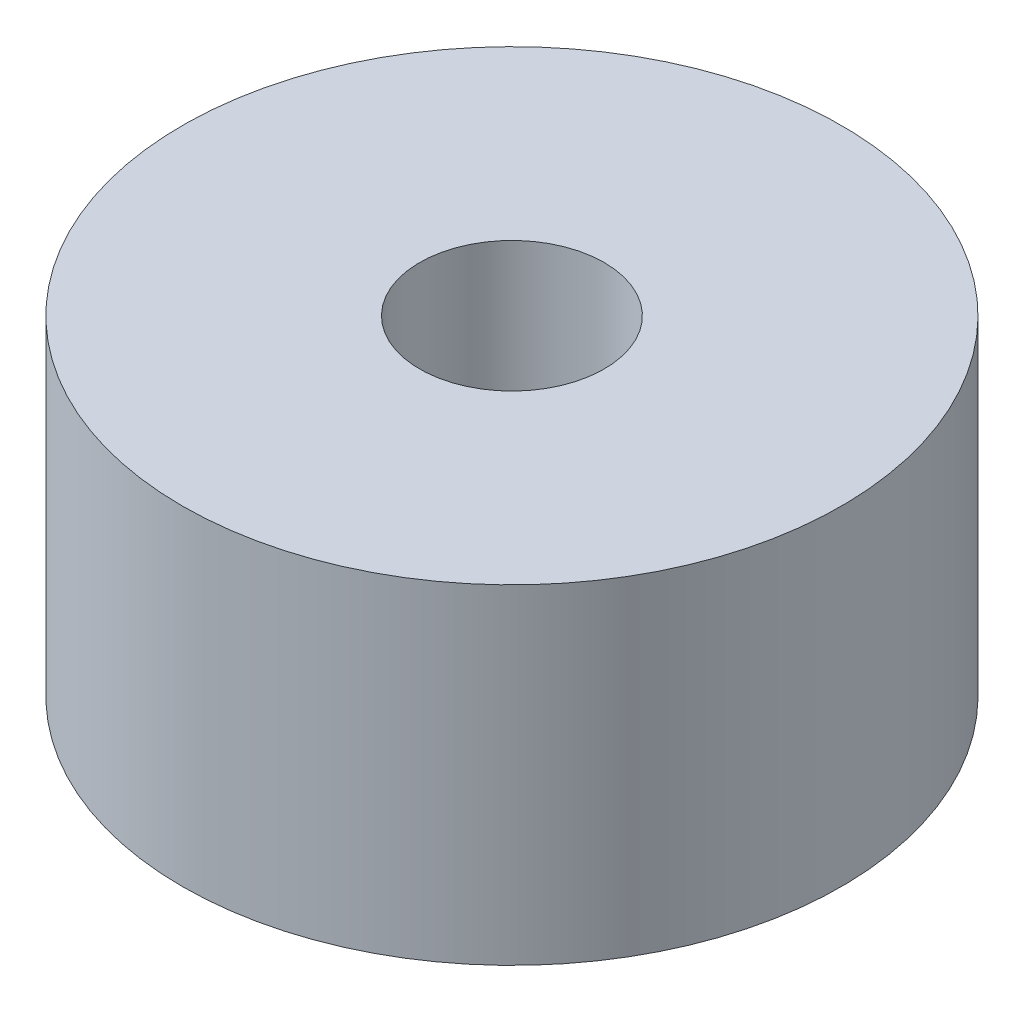
ISO-10303-21;
HEADER;
FILE_DESCRIPTION(('STEP AP214'),'2;1');
FILE_NAME('part.step','',(''),(''),'','','');
FILE_SCHEMA(('AUTOMOTIVE_DESIGN { 1 0 10303 214 1 1 1 1 }'));
ENDSEC;
DATA;
#1=APPLICATION_CONTEXT('core data for automotive mechanical design processes');
#2=APPLICATION_PROTOCOL_DEFINITION('international standard','automotive_design',2000,#1);
#3=PRODUCT_CONTEXT('',#1,'mechanical');
#4=PRODUCT('Part','Part','',(#3));
#5=PRODUCT_RELATED_PRODUCT_CATEGORY('part','',(#4));
#6=PRODUCT_DEFINITION_FORMATION('','',#4);
#7=PRODUCT_DEFINITION_CONTEXT('part definition',#1,'design');
#8=PRODUCT_DEFINITION('design','',#6,#7);
#9=PRODUCT_DEFINITION_SHAPE('','',#8);
#10=(LENGTH_UNIT() NAMED_UNIT(*) SI_UNIT(.MILLI.,.METRE.));
#11=(NAMED_UNIT(*) PLANE_ANGLE_UNIT() SI_UNIT($,.RADIAN.));
#12=(NAMED_UNIT(*) SI_UNIT($,.STERADIAN.) SOLID_ANGLE_UNIT());
#13=UNCERTAINTY_MEASURE_WITH_UNIT(LENGTH_MEASURE(1.E-05),#10,'distance_accuracy_value','');
#14=(GEOMETRIC_REPRESENTATION_CONTEXT(3) GLOBAL_UNCERTAINTY_ASSIGNED_CONTEXT((#13)) GLOBAL_UNIT_ASSIGNED_CONTEXT((#10,
#11,#12)) REPRESENTATION_CONTEXT('',''));
#15=CARTESIAN_POINT('',(0.,0.,0.));
#16=DIRECTION('',(0.,0.,1.));
#17=DIRECTION('',(1.,0.,0.));
#18=AXIS2_PLACEMENT_3D('',#15,#16,#17);
#19=CARTESIAN_POINT('',(0.,5.,0.));
#20=DIRECTION('',(0.,-1.,0.));
#21=DIRECTION('',(0.,0.,-1.));
#22=AXIS2_PLACEMENT_3D('',#19,#20,#21);
#23=CYLINDRICAL_SURFACE('',#22,5.);
#24=CARTESIAN_POINT('',(0.,5.,0.));
#25=DIRECTION('',(0.,1.,0.));
#26=DIRECTION('',(0.,0.,1.));
#27=AXIS2_PLACEMENT_3D('',#24,#25,#26);
#28=CIRCLE('',#27,5.);
#29=CARTESIAN_POINT('',(0.,5.,5.));
#30=VERTEX_POINT('',#29);
#31=EDGE_CURVE('E10',#30,#30,#28,.T.);
#32=ORIENTED_EDGE('',*,*,#31,.F.);
#33=EDGE_LOOP('',(#32));
#34=FACE_BOUND('',#33,.T.);
#35=CARTESIAN_POINT('',(0.,0.,0.));
#36=DIRECTION('',(0.,1.,0.));
#37=DIRECTION('',(0.,0.,1.));
#38=AXIS2_PLACEMENT_3D('',#35,#36,#37);
#39=CIRCLE('',#38,5.);
#40=CARTESIAN_POINT('',(0.,0.,5.));
#41=VERTEX_POINT('',#40);
#42=EDGE_CURVE('E36',#41,#41,#39,.T.);
#43=ORIENTED_EDGE('',*,*,#42,.T.);
#44=EDGE_LOOP('',(#43));
#45=FACE_BOUND('',#44,.T.);
#46=ADVANCED_FACE('F33',(#34,#45),#23,.T.);
#47=CARTESIAN_POINT('',(0.,5.,0.));
#48=DIRECTION('',(0.,1.,0.));
#49=DIRECTION('',(0.,0.,1.));
#50=AXIS2_PLACEMENT_3D('',#47,#48,#49);
#51=PLANE('',#50);
#52=CARTESIAN_POINT('',(0.,5.,0.));
#53=DIRECTION('',(0.,1.,0.));
#54=DIRECTION('',(0.,0.,1.));
#55=AXIS2_PLACEMENT_3D('',#52,#53,#54);
#56=CIRCLE('',#55,1.4);
#57=CARTESIAN_POINT('',(0.,5.,-1.4));
#58=VERTEX_POINT('',#57);
#59=EDGE_CURVE('E43',#58,#58,#56,.T.);
#60=ORIENTED_EDGE('',*,*,#59,.F.);
#61=EDGE_LOOP('',(#60));
#62=FACE_BOUND('',#61,.T.);
#63=ORIENTED_EDGE('',*,*,#31,.T.);
#64=EDGE_LOOP('',(#63));
#65=FACE_BOUND('',#64,.T.);
#66=ADVANCED_FACE('F56',(#62,#65),#51,.T.);
#67=CARTESIAN_POINT('',(0.,0.,0.));
#68=DIRECTION('',(0.,1.,0.));
#69=DIRECTION('',(0.,0.,1.));
#70=AXIS2_PLACEMENT_3D('',#67,#68,#69);
#71=PLANE('',#70);
#72=CARTESIAN_POINT('',(0.,0.,0.));
#73=DIRECTION('',(0.,-1.,0.));
#74=DIRECTION('',(0.,0.,-1.));
#75=AXIS2_PLACEMENT_3D('',#72,#73,#74);
#76=CIRCLE('',#75,1.4);
#77=CARTESIAN_POINT('',(0.,0.,-1.4));
#78=VERTEX_POINT('',#77);
#79=EDGE_CURVE('E47',#78,#78,#76,.T.);
#80=ORIENTED_EDGE('',*,*,#79,.F.);
#81=EDGE_LOOP('',(#80));
#82=FACE_BOUND('',#81,.T.);
#83=ORIENTED_EDGE('',*,*,#42,.F.);
#84=EDGE_LOOP('',(#83));
#85=FACE_BOUND('',#84,.T.);
#86=ADVANCED_FACE('F53',(#82,#85),#71,.F.);
#87=CARTESIAN_POINT('',(0.,7.7,0.));
#88=DIRECTION('',(0.,-1.,0.));
#89=DIRECTION('',(0.,0.,-1.));
#90=AXIS2_PLACEMENT_3D('',#87,#88,#89);
#91=CYLINDRICAL_SURFACE('',#90,1.4);
#92=CARTESIAN_POINT('',(0.,5.,-1.4));
#93=CARTESIAN_POINT('',(0.,4.94791666666667,-1.4));
#94=CARTESIAN_POINT('',(0.,4.89583333333333,-1.4));
#95=CARTESIAN_POINT('',(0.,4.79166666666667,-1.4));
#96=CARTESIAN_POINT('',(0.,4.73958333333333,-1.4));
#97=CARTESIAN_POINT('',(0.,4.63541666666667,-1.4));
#98=CARTESIAN_POINT('',(0.,4.58333333333333,-1.4));
#99=CARTESIAN_POINT('',(0.,4.47916666666667,-1.4));
#100=CARTESIAN_POINT('',(0.,4.42708333333333,-1.4));
#101=CARTESIAN_POINT('',(0.,4.32291666666667,-1.4));
#102=CARTESIAN_POINT('',(0.,4.27083333333333,-1.4));
#103=CARTESIAN_POINT('',(0.,4.16666666666667,-1.4));
#104=CARTESIAN_POINT('',(0.,4.11458333333333,-1.4));
#105=CARTESIAN_POINT('',(0.,4.01041666666667,-1.4));
#106=CARTESIAN_POINT('',(0.,3.95833333333333,-1.4));
#107=CARTESIAN_POINT('',(0.,3.85416666666667,-1.4));
#108=CARTESIAN_POINT('',(0.,3.80208333333333,-1.4));
#109=CARTESIAN_POINT('',(0.,3.69791666666667,-1.4));
#110=CARTESIAN_POINT('',(0.,3.64583333333333,-1.4));
#111=CARTESIAN_POINT('',(0.,3.54166666666667,-1.4));
#112=CARTESIAN_POINT('',(0.,3.48958333333333,-1.4));
#113=CARTESIAN_POINT('',(0.,3.38541666666667,-1.4));
#114=CARTESIAN_POINT('',(0.,3.33333333333333,-1.4));
#115=CARTESIAN_POINT('',(0.,3.22916666666667,-1.4));
#116=CARTESIAN_POINT('',(0.,3.17708333333333,-1.4));
#117=CARTESIAN_POINT('',(0.,3.07291666666667,-1.4));
#118=CARTESIAN_POINT('',(0.,3.02083333333333,-1.4));
#119=CARTESIAN_POINT('',(0.,2.91666666666667,-1.4));
#120=CARTESIAN_POINT('',(0.,2.86458333333333,-1.4));
#121=CARTESIAN_POINT('',(0.,2.76041666666667,-1.4));
#122=CARTESIAN_POINT('',(0.,2.70833333333333,-1.4));
#123=CARTESIAN_POINT('',(0.,2.60416666666667,-1.4));
#124=CARTESIAN_POINT('',(0.,2.55208333333333,-1.4));
#125=CARTESIAN_POINT('',(0.,2.44791666666667,-1.4));
#126=CARTESIAN_POINT('',(0.,2.39583333333333,-1.4));
#127=CARTESIAN_POINT('',(0.,2.29166666666667,-1.4));
#128=CARTESIAN_POINT('',(0.,2.23958333333333,-1.4));
#129=CARTESIAN_POINT('',(0.,2.13541666666667,-1.4));
#130=CARTESIAN_POINT('',(0.,2.08333333333333,-1.4));
#131=CARTESIAN_POINT('',(0.,1.97916666666667,-1.4));
#132=CARTESIAN_POINT('',(0.,1.92708333333333,-1.4));
#133=CARTESIAN_POINT('',(0.,1.82291666666667,-1.4));
#134=CARTESIAN_POINT('',(0.,1.77083333333333,-1.4));
#135=CARTESIAN_POINT('',(0.,1.66666666666667,-1.4));
#136=CARTESIAN_POINT('',(0.,1.61458333333333,-1.4));
#137=CARTESIAN_POINT('',(0.,1.51041666666667,-1.4));
#138=CARTESIAN_POINT('',(0.,1.45833333333333,-1.4));
#139=CARTESIAN_POINT('',(0.,1.35416666666667,-1.4));
#140=CARTESIAN_POINT('',(0.,1.30208333333333,-1.4));
#141=CARTESIAN_POINT('',(0.,1.19791666666667,-1.4));
#142=CARTESIAN_POINT('',(0.,1.14583333333333,-1.4));
#143=CARTESIAN_POINT('',(0.,1.04166666666667,-1.4));
#144=CARTESIAN_POINT('',(0.,0.989583333333334,-1.4));
#145=CARTESIAN_POINT('',(0.,0.885416666666668,-1.4));
#146=CARTESIAN_POINT('',(0.,0.833333333333334,-1.4));
#147=CARTESIAN_POINT('',(0.,0.729166666666667,-1.4));
#148=CARTESIAN_POINT('',(0.,0.677083333333334,-1.4));
#149=CARTESIAN_POINT('',(0.,0.572916666666667,-1.4));
#150=CARTESIAN_POINT('',(0.,0.520833333333334,-1.4));
#151=CARTESIAN_POINT('',(0.,0.416666666666667,-1.4));
#152=CARTESIAN_POINT('',(0.,0.364583333333334,-1.4));
#153=CARTESIAN_POINT('',(0.,0.260416666666668,-1.4));
#154=CARTESIAN_POINT('',(0.,0.208333333333334,-1.4));
#155=CARTESIAN_POINT('',(0.,0.104166666666668,-1.4));
#156=CARTESIAN_POINT('',(0.,0.0520833333333343,-1.4));
#157=CARTESIAN_POINT('',(0.,0.,-1.4));
#158=B_SPLINE_CURVE_WITH_KNOTS('',3,(#92,#93,#94,#95,#96,#97,#98,#99,#100,#101,#102,#103,#104,
#105,#106,#107,#108,#109,#110,#111,#112,#113,#114,#115,#116,#117,#118,#119,#120,#121,#122,#123,
#124,#125,#126,#127,#128,#129,#130,#131,#132,#133,#134,#135,#136,#137,#138,#139,#140,#141,#142,
#143,#144,#145,#146,#147,#148,#149,#150,#151,#152,#153,#154,#155,#156,#157),.UNSPECIFIED.,.F.,
.F.,(4,2,2,2,2,2,2,2,2,2,2,2,2,2,2,2,2,2,2,2,2,2,2,2,2,2,2,2,2,2,2,2,4),(0.,0.15625,
0.312499999999999,0.46875,0.624999999999999,0.781249999999999,0.937499999999999,1.09375,1.25,
1.40625,1.5625,1.71875,1.875,2.03125,2.1875,2.34375,2.5,2.65625,2.8125,2.96875,3.125,3.28125,
3.4375,3.59375,3.75,3.90625,4.0625,4.21875,4.375,4.53125,4.6875,4.84375,5.),.UNSPECIFIED.);
#159=EDGE_CURVE('BSEAM51',#58,#78,#158,.T.);
#160=ORIENTED_EDGE('',*,*,#59,.T.);
#161=ORIENTED_EDGE('',*,*,#79,.T.);
#162=ORIENTED_EDGE('',*,*,#159,.T.);
#163=ORIENTED_EDGE('',*,*,#159,.F.);
#164=EDGE_LOOP('',(#160,#162,#161,#163));
#165=FACE_BOUND('',#164,.T.);
#166=ADVANCED_FACE('F51',(#165),#91,.F.);
#167=CLOSED_SHELL('',(#46,#66,#86,#166));
#168=MANIFOLD_SOLID_BREP('B2',#167);
#169=ADVANCED_BREP_SHAPE_REPRESENTATION('',(#18,#168),#14);
#170=SHAPE_DEFINITION_REPRESENTATION(#9,#169);
ENDSEC;
END-ISO-10303-21;
